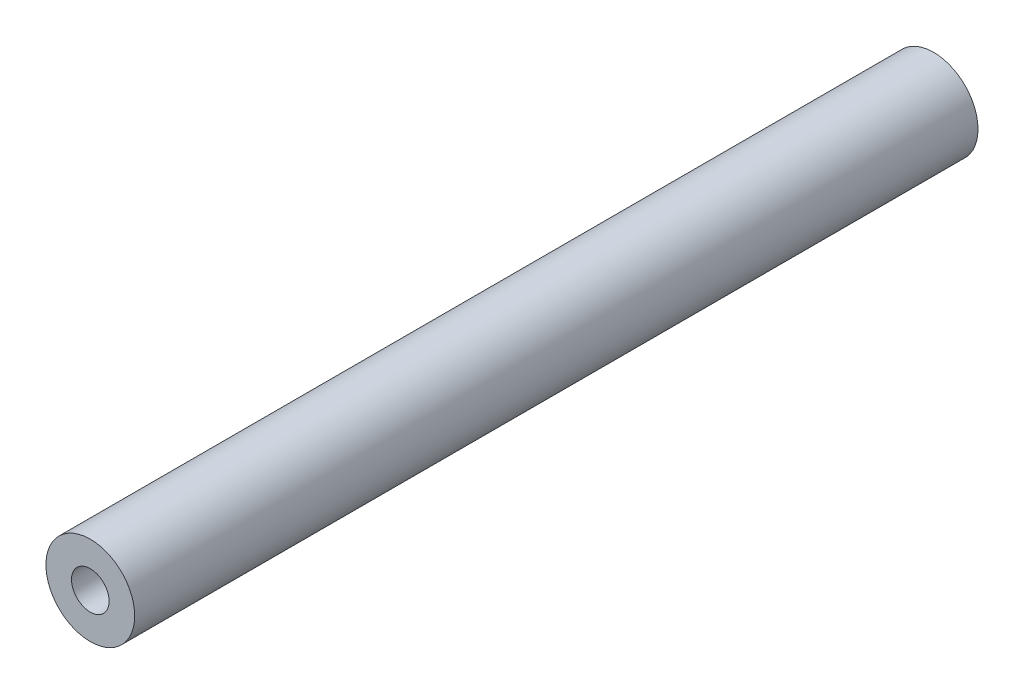
ISO-10303-21;
HEADER;
FILE_DESCRIPTION(('STEP AP214'),'2;1');
FILE_NAME('part.step','',(''),(''),'','','');
FILE_SCHEMA(('AUTOMOTIVE_DESIGN { 1 0 10303 214 1 1 1 1 }'));
ENDSEC;
DATA;
#1=APPLICATION_CONTEXT('core data for automotive mechanical design processes');
#2=APPLICATION_PROTOCOL_DEFINITION('international standard','automotive_design',2000,#1);
#3=PRODUCT_CONTEXT('',#1,'mechanical');
#4=PRODUCT('Part','Part','',(#3));
#5=PRODUCT_RELATED_PRODUCT_CATEGORY('part','',(#4));
#6=PRODUCT_DEFINITION_FORMATION('','',#4);
#7=PRODUCT_DEFINITION_CONTEXT('part definition',#1,'design');
#8=PRODUCT_DEFINITION('design','',#6,#7);
#9=PRODUCT_DEFINITION_SHAPE('','',#8);
#10=(LENGTH_UNIT() NAMED_UNIT(*) SI_UNIT(.MILLI.,.METRE.));
#11=(NAMED_UNIT(*) PLANE_ANGLE_UNIT() SI_UNIT($,.RADIAN.));
#12=(NAMED_UNIT(*) SI_UNIT($,.STERADIAN.) SOLID_ANGLE_UNIT());
#13=UNCERTAINTY_MEASURE_WITH_UNIT(LENGTH_MEASURE(1.E-05),#10,'distance_accuracy_value','');
#14=(GEOMETRIC_REPRESENTATION_CONTEXT(3) GLOBAL_UNCERTAINTY_ASSIGNED_CONTEXT((#13)) GLOBAL_UNIT_ASSIGNED_CONTEXT((#10,
#11,#12)) REPRESENTATION_CONTEXT('',''));
#15=CARTESIAN_POINT('',(0.,0.,0.));
#16=DIRECTION('',(0.,0.,1.));
#17=DIRECTION('',(1.,0.,0.));
#18=AXIS2_PLACEMENT_3D('',#15,#16,#17);
#19=CARTESIAN_POINT('',(0.,0.,90.4875));
#20=DIRECTION('',(0.,0.,-1.));
#21=DIRECTION('',(-1.,0.,0.));
#22=AXIS2_PLACEMENT_3D('',#19,#20,#21);
#23=CYLINDRICAL_SURFACE('',#22,4.7625);
#24=CARTESIAN_POINT('',(0.,0.,90.4875));
#25=DIRECTION('',(0.,0.,1.));
#26=DIRECTION('',(1.,0.,0.));
#27=AXIS2_PLACEMENT_3D('',#24,#25,#26);
#28=CIRCLE('',#27,4.7625);
#29=CARTESIAN_POINT('',(4.7625,0.,90.4875));
#30=VERTEX_POINT('',#29);
#31=EDGE_CURVE('E10',#30,#30,#28,.T.);
#32=ORIENTED_EDGE('',*,*,#31,.F.);
#33=EDGE_LOOP('',(#32));
#34=FACE_BOUND('',#33,.T.);
#35=CARTESIAN_POINT('',(0.,0.,0.));
#36=DIRECTION('',(0.,0.,1.));
#37=DIRECTION('',(1.,0.,0.));
#38=AXIS2_PLACEMENT_3D('',#35,#36,#37);
#39=CIRCLE('',#38,4.7625);
#40=CARTESIAN_POINT('',(4.7625,0.,0.));
#41=VERTEX_POINT('',#40);
#42=EDGE_CURVE('E41',#41,#41,#39,.T.);
#43=ORIENTED_EDGE('',*,*,#42,.T.);
#44=EDGE_LOOP('',(#43));
#45=FACE_BOUND('',#44,.T.);
#46=ADVANCED_FACE('F38',(#34,#45),#23,.T.);
#47=CARTESIAN_POINT('',(0.,0.,90.4875));
#48=DIRECTION('',(0.,0.,1.));
#49=DIRECTION('',(1.,0.,0.));
#50=AXIS2_PLACEMENT_3D('',#47,#48,#49);
#51=PLANE('',#50);
#52=CARTESIAN_POINT('',(0.,0.,90.4875));
#53=DIRECTION('',(0.,0.,1.));
#54=DIRECTION('',(1.,0.,0.));
#55=AXIS2_PLACEMENT_3D('',#52,#53,#54);
#56=CIRCLE('',#55,2.01929999999998);
#57=CARTESIAN_POINT('',(2.01929999999998,0.,90.4875));
#58=VERTEX_POINT('',#57);
#59=EDGE_CURVE('E52',#58,#58,#56,.T.);
#60=ORIENTED_EDGE('',*,*,#59,.F.);
#61=EDGE_LOOP('',(#60));
#62=FACE_BOUND('',#61,.T.);
#63=ORIENTED_EDGE('',*,*,#31,.T.);
#64=EDGE_LOOP('',(#63));
#65=FACE_BOUND('',#64,.T.);
#66=ADVANCED_FACE('F58',(#62,#65),#51,.T.);
#67=CARTESIAN_POINT('',(0.,0.,0.));
#68=DIRECTION('',(0.,0.,1.));
#69=DIRECTION('',(1.,0.,0.));
#70=AXIS2_PLACEMENT_3D('',#67,#68,#69);
#71=PLANE('',#70);
#72=CARTESIAN_POINT('',(0.,0.,0.));
#73=DIRECTION('',(0.,0.,1.));
#74=DIRECTION('',(1.,0.,0.));
#75=AXIS2_PLACEMENT_3D('',#72,#73,#74);
#76=CIRCLE('',#75,2.01929999999997);
#77=CARTESIAN_POINT('',(2.01929999999997,0.,0.));
#78=VERTEX_POINT('',#77);
#79=EDGE_CURVE('E48',#78,#78,#76,.T.);
#80=ORIENTED_EDGE('',*,*,#79,.T.);
#81=EDGE_LOOP('',(#80));
#82=FACE_BOUND('',#81,.T.);
#83=ORIENTED_EDGE('',*,*,#42,.F.);
#84=EDGE_LOOP('',(#83));
#85=FACE_BOUND('',#84,.T.);
#86=ADVANCED_FACE('F60',(#82,#85),#71,.F.);
#87=CARTESIAN_POINT('',(0.,0.,90.4875));
#88=DIRECTION('',(0.,0.,1.));
#89=DIRECTION('',(1.,0.,0.));
#90=AXIS2_PLACEMENT_3D('',#87,#88,#89);
#91=CYLINDRICAL_SURFACE('',#90,2.01929999999998);
#92=ORIENTED_EDGE('',*,*,#79,.F.);
#93=EDGE_LOOP('',(#92));
#94=FACE_BOUND('',#93,.T.);
#95=ORIENTED_EDGE('',*,*,#59,.T.);
#96=EDGE_LOOP('',(#95));
#97=FACE_BOUND('',#96,.T.);
#98=ADVANCED_FACE('F56',(#94,#97),#91,.F.);
#99=CLOSED_SHELL('',(#46,#66,#86,#98));
#100=MANIFOLD_SOLID_BREP('B2',#99);
#101=ADVANCED_BREP_SHAPE_REPRESENTATION('',(#18,#100),#14);
#102=SHAPE_DEFINITION_REPRESENTATION(#9,#101);
ENDSEC;
END-ISO-10303-21;
